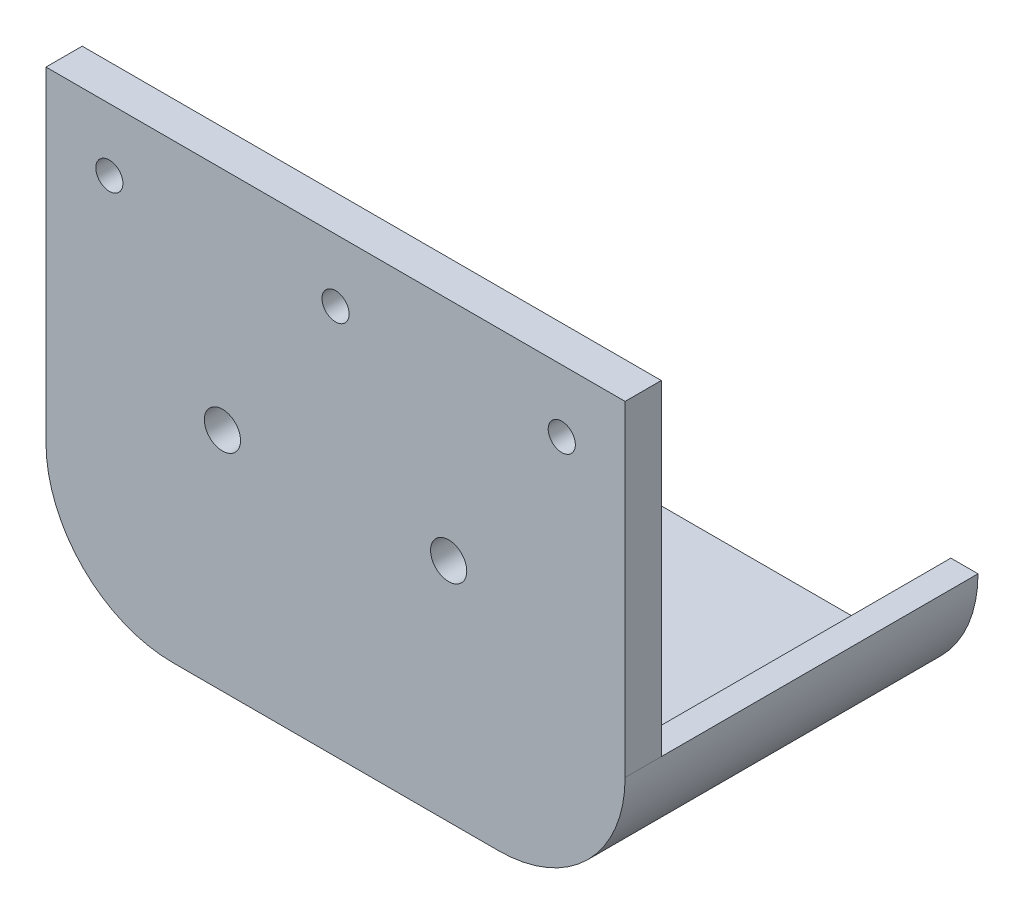
ISO-10303-21;
HEADER;
FILE_DESCRIPTION(('STEP AP214'),'2;1');
FILE_NAME('part.step','',(''),(''),'','','');
FILE_SCHEMA(('AUTOMOTIVE_DESIGN { 1 0 10303 214 1 1 1 1 }'));
ENDSEC;
DATA;
#1=APPLICATION_CONTEXT('core data for automotive mechanical design processes');
#2=APPLICATION_PROTOCOL_DEFINITION('international standard','automotive_design',2000,#1);
#3=PRODUCT_CONTEXT('',#1,'mechanical');
#4=PRODUCT('Part','Part','',(#3));
#5=PRODUCT_RELATED_PRODUCT_CATEGORY('part','',(#4));
#6=PRODUCT_DEFINITION_FORMATION('','',#4);
#7=PRODUCT_DEFINITION_CONTEXT('part definition',#1,'design');
#8=PRODUCT_DEFINITION('design','',#6,#7);
#9=PRODUCT_DEFINITION_SHAPE('','',#8);
#10=(LENGTH_UNIT() NAMED_UNIT(*) SI_UNIT(.MILLI.,.METRE.));
#11=(NAMED_UNIT(*) PLANE_ANGLE_UNIT() SI_UNIT($,.RADIAN.));
#12=(NAMED_UNIT(*) SI_UNIT($,.STERADIAN.) SOLID_ANGLE_UNIT());
#13=UNCERTAINTY_MEASURE_WITH_UNIT(LENGTH_MEASURE(1.E-05),#10,'distance_accuracy_value','');
#14=(GEOMETRIC_REPRESENTATION_CONTEXT(3) GLOBAL_UNCERTAINTY_ASSIGNED_CONTEXT((#13)) GLOBAL_UNIT_ASSIGNED_CONTEXT((#10,
#11,#12)) REPRESENTATION_CONTEXT('',''));
#15=CARTESIAN_POINT('',(0.,0.,0.));
#16=DIRECTION('',(0.,0.,1.));
#17=DIRECTION('',(1.,0.,0.));
#18=AXIS2_PLACEMENT_3D('',#15,#16,#17);
#19=CARTESIAN_POINT('',(0.,0.,0.));
#20=DIRECTION('',(0.,0.,-1.));
#21=DIRECTION('',(-1.,0.,0.));
#22=AXIS2_PLACEMENT_3D('',#19,#20,#21);
#23=PLANE('',#22);
#24=CARTESIAN_POINT('',(125.,90.5193349511584,0.));
#25=DIRECTION('',(0.,0.,1.));
#26=DIRECTION('',(1.,0.,0.));
#27=AXIS2_PLACEMENT_3D('',#24,#25,#26);
#28=CIRCLE('',#27,7.50000000000001);
#29=CARTESIAN_POINT('',(132.5,90.5193349511584,0.));
#30=VERTEX_POINT('',#29);
#31=EDGE_CURVE('E188',#30,#30,#28,.T.);
#32=ORIENTED_EDGE('',*,*,#31,.T.);
#33=EDGE_LOOP('',(#32));
#34=FACE_BOUND('',#33,.T.);
#35=CARTESIAN_POINT('',(-125.,90.5193349511584,0.));
#36=DIRECTION('',(0.,0.,1.));
#37=DIRECTION('',(1.,0.,0.));
#38=AXIS2_PLACEMENT_3D('',#35,#36,#37);
#39=CIRCLE('',#38,7.50000000000001);
#40=CARTESIAN_POINT('',(-117.5,90.5193349511584,0.));
#41=VERTEX_POINT('',#40);
#42=EDGE_CURVE('E193',#41,#41,#39,.T.);
#43=ORIENTED_EDGE('',*,*,#42,.T.);
#44=EDGE_LOOP('',(#43));
#45=FACE_BOUND('',#44,.T.);
#46=CARTESIAN_POINT('',(0.,90.5193349511584,0.));
#47=DIRECTION('',(0.,0.,1.));
#48=DIRECTION('',(1.,0.,0.));
#49=AXIS2_PLACEMENT_3D('',#46,#47,#48);
#50=CIRCLE('',#49,7.5);
#51=CARTESIAN_POINT('',(7.5,90.5193349511584,0.));
#52=VERTEX_POINT('',#51);
#53=EDGE_CURVE('E201',#52,#52,#50,.T.);
#54=ORIENTED_EDGE('',*,*,#53,.T.);
#55=EDGE_LOOP('',(#54));
#56=FACE_BOUND('',#55,.T.);
#57=CARTESIAN_POINT('',(62.5,0.,0.));
#58=DIRECTION('',(0.,0.,1.));
#59=DIRECTION('',(1.,0.,0.));
#60=AXIS2_PLACEMENT_3D('',#57,#58,#59);
#61=CIRCLE('',#60,9.99999999999999);
#62=CARTESIAN_POINT('',(72.5,0.,0.));
#63=VERTEX_POINT('',#62);
#64=EDGE_CURVE('E210',#63,#63,#61,.T.);
#65=ORIENTED_EDGE('',*,*,#64,.T.);
#66=EDGE_LOOP('',(#65));
#67=FACE_BOUND('',#66,.T.);
#68=CARTESIAN_POINT('',(-62.5,0.,0.));
#69=DIRECTION('',(0.,0.,1.));
#70=DIRECTION('',(1.,0.,0.));
#71=AXIS2_PLACEMENT_3D('',#68,#69,#70);
#72=CIRCLE('',#71,9.99999999999999);
#73=CARTESIAN_POINT('',(-52.5,0.,0.));
#74=VERTEX_POINT('',#73);
#75=EDGE_CURVE('E204',#74,#74,#72,.T.);
#76=ORIENTED_EDGE('',*,*,#75,.T.);
#77=EDGE_LOOP('',(#76));
#78=FACE_BOUND('',#77,.T.);
#79=DIRECTION('',(0.,1.,0.));
#80=VECTOR('',#79,1.);
#81=CARTESIAN_POINT('',(160.,-125.,0.));
#82=LINE('',#81,#80);
#83=CARTESIAN_POINT('',(160.,-55.,0.));
#84=VERTEX_POINT('',#83);
#85=CARTESIAN_POINT('',(160.,125.,0.));
#86=VERTEX_POINT('',#85);
#87=EDGE_CURVE('E216',#84,#86,#82,.T.);
#88=ORIENTED_EDGE('',*,*,#87,.F.);
#89=DIRECTION('',(-1.,0.,0.));
#90=VECTOR('',#89,1.);
#91=CARTESIAN_POINT('',(0.,-55.,0.));
#92=LINE('',#91,#90);
#93=CARTESIAN_POINT('',(145.,-55.,0.));
#94=VERTEX_POINT('',#93);
#95=EDGE_CURVE('E146',#84,#94,#92,.T.);
#96=ORIENTED_EDGE('',*,*,#95,.T.);
#97=CARTESIAN_POINT('',(89.9999999999993,-55.,0.));
#98=DIRECTION('',(0.,0.,-1.));
#99=DIRECTION('',(-1.,0.,0.));
#100=AXIS2_PLACEMENT_3D('',#97,#98,#99);
#101=CIRCLE('',#100,55.0000000000002);
#102=CARTESIAN_POINT('',(90.,-110.,0.));
#103=VERTEX_POINT('',#102);
#104=EDGE_CURVE('E149',#94,#103,#101,.T.);
#105=ORIENTED_EDGE('',*,*,#104,.T.);
#106=DIRECTION('',(-1.,0.,0.));
#107=VECTOR('',#106,1.);
#108=CARTESIAN_POINT('',(0.,-110.,0.));
#109=LINE('',#108,#107);
#110=CARTESIAN_POINT('',(-90.0000000000007,-110.,0.));
#111=VERTEX_POINT('',#110);
#112=EDGE_CURVE('E173',#103,#111,#109,.T.);
#113=ORIENTED_EDGE('',*,*,#112,.T.);
#114=CARTESIAN_POINT('',(-90.0000000000007,-55.,0.));
#115=DIRECTION('',(0.,0.,-1.));
#116=DIRECTION('',(-1.,0.,0.));
#117=AXIS2_PLACEMENT_3D('',#114,#115,#116);
#118=CIRCLE('',#117,54.9999999999996);
#119=CARTESIAN_POINT('',(-145.,-55.,0.));
#120=VERTEX_POINT('',#119);
#121=EDGE_CURVE('E170',#111,#120,#118,.T.);
#122=ORIENTED_EDGE('',*,*,#121,.T.);
#123=DIRECTION('',(-1.,0.,0.));
#124=VECTOR('',#123,1.);
#125=CARTESIAN_POINT('',(0.,-55.,0.));
#126=LINE('',#125,#124);
#127=CARTESIAN_POINT('',(-160.,-55.,0.));
#128=VERTEX_POINT('',#127);
#129=EDGE_CURVE('E167',#120,#128,#126,.T.);
#130=ORIENTED_EDGE('',*,*,#129,.T.);
#131=DIRECTION('',(0.,-1.,0.));
#132=VECTOR('',#131,1.);
#133=CARTESIAN_POINT('',(-160.,-125.,0.));
#134=LINE('',#133,#132);
#135=CARTESIAN_POINT('',(-160.,125.,0.));
#136=VERTEX_POINT('',#135);
#137=EDGE_CURVE('E222',#136,#128,#134,.T.);
#138=ORIENTED_EDGE('',*,*,#137,.F.);
#139=DIRECTION('',(-1.,0.,0.));
#140=VECTOR('',#139,1.);
#141=CARTESIAN_POINT('',(-160.,125.,0.));
#142=LINE('',#141,#140);
#143=EDGE_CURVE('E229',#86,#136,#142,.T.);
#144=ORIENTED_EDGE('',*,*,#143,.F.);
#145=EDGE_LOOP('',(#88,#96,#105,#113,#122,#130,#138,#144));
#146=FACE_BOUND('',#145,.T.);
#147=ADVANCED_FACE('F41',(#34,#45,#56,#67,#78,#146),#23,.T.);
#148=CARTESIAN_POINT('',(0.,0.,20.));
#149=DIRECTION('',(0.,0.,-1.));
#150=DIRECTION('',(-1.,0.,0.));
#151=AXIS2_PLACEMENT_3D('',#148,#149,#150);
#152=PLANE('',#151);
#153=CARTESIAN_POINT('',(125.,90.5193349511584,20.));
#154=DIRECTION('',(0.,0.,1.));
#155=DIRECTION('',(1.,0.,0.));
#156=AXIS2_PLACEMENT_3D('',#153,#154,#155);
#157=CIRCLE('',#156,7.50000000000001);
#158=CARTESIAN_POINT('',(132.5,90.5193349511584,20.));
#159=VERTEX_POINT('',#158);
#160=EDGE_CURVE('E196',#159,#159,#157,.T.);
#161=ORIENTED_EDGE('',*,*,#160,.F.);
#162=EDGE_LOOP('',(#161));
#163=FACE_BOUND('',#162,.T.);
#164=CARTESIAN_POINT('',(-125.,90.5193349511584,20.));
#165=DIRECTION('',(0.,0.,1.));
#166=DIRECTION('',(1.,0.,0.));
#167=AXIS2_PLACEMENT_3D('',#164,#165,#166);
#168=CIRCLE('',#167,7.50000000000001);
#169=CARTESIAN_POINT('',(-117.5,90.5193349511584,20.));
#170=VERTEX_POINT('',#169);
#171=EDGE_CURVE('E189',#170,#170,#168,.T.);
#172=ORIENTED_EDGE('',*,*,#171,.F.);
#173=EDGE_LOOP('',(#172));
#174=FACE_BOUND('',#173,.T.);
#175=CARTESIAN_POINT('',(0.,90.5193349511584,20.));
#176=DIRECTION('',(0.,0.,1.));
#177=DIRECTION('',(1.,0.,0.));
#178=AXIS2_PLACEMENT_3D('',#175,#176,#177);
#179=CIRCLE('',#178,7.5);
#180=CARTESIAN_POINT('',(7.5,90.5193349511584,20.));
#181=VERTEX_POINT('',#180);
#182=EDGE_CURVE('E192',#181,#181,#179,.T.);
#183=ORIENTED_EDGE('',*,*,#182,.F.);
#184=EDGE_LOOP('',(#183));
#185=FACE_BOUND('',#184,.T.);
#186=DIRECTION('',(1.,0.,0.));
#187=VECTOR('',#186,1.);
#188=CARTESIAN_POINT('',(-160.,-125.,20.));
#189=LINE('',#188,#187);
#190=CARTESIAN_POINT('',(-90.,-125.,20.));
#191=VERTEX_POINT('',#190);
#192=CARTESIAN_POINT('',(90.,-125.,20.));
#193=VERTEX_POINT('',#192);
#194=EDGE_CURVE('E128',#191,#193,#189,.T.);
#195=ORIENTED_EDGE('',*,*,#194,.T.);
#196=CARTESIAN_POINT('',(90.,-55.,20.));
#197=DIRECTION('',(0.,0.,-1.));
#198=DIRECTION('',(-1.,0.,0.));
#199=AXIS2_PLACEMENT_3D('',#196,#197,#198);
#200=CIRCLE('',#199,70.);
#201=CARTESIAN_POINT('',(160.,-55.,20.));
#202=VERTEX_POINT('',#201);
#203=EDGE_CURVE('E49',#193,#202,#200,.F.);
#204=ORIENTED_EDGE('',*,*,#203,.T.);
#205=DIRECTION('',(0.,1.,0.));
#206=VECTOR('',#205,1.);
#207=CARTESIAN_POINT('',(160.,-125.,20.));
#208=LINE('',#207,#206);
#209=CARTESIAN_POINT('',(160.,125.,20.));
#210=VERTEX_POINT('',#209);
#211=EDGE_CURVE('E219',#202,#210,#208,.T.);
#212=ORIENTED_EDGE('',*,*,#211,.T.);
#213=DIRECTION('',(-1.,0.,0.));
#214=VECTOR('',#213,1.);
#215=CARTESIAN_POINT('',(-160.,125.,20.));
#216=LINE('',#215,#214);
#217=CARTESIAN_POINT('',(-160.,125.,20.));
#218=VERTEX_POINT('',#217);
#219=EDGE_CURVE('E221',#210,#218,#216,.T.);
#220=ORIENTED_EDGE('',*,*,#219,.T.);
#221=DIRECTION('',(0.,-1.,0.));
#222=VECTOR('',#221,1.);
#223=CARTESIAN_POINT('',(-160.,-125.,20.));
#224=LINE('',#223,#222);
#225=CARTESIAN_POINT('',(-160.,-55.,20.));
#226=VERTEX_POINT('',#225);
#227=EDGE_CURVE('E224',#218,#226,#224,.T.);
#228=ORIENTED_EDGE('',*,*,#227,.T.);
#229=CARTESIAN_POINT('',(-90.,-55.,20.));
#230=DIRECTION('',(0.,0.,-1.));
#231=DIRECTION('',(-1.,0.,0.));
#232=AXIS2_PLACEMENT_3D('',#229,#230,#231);
#233=CIRCLE('',#232,70.);
#234=EDGE_CURVE('E240',#226,#191,#233,.F.);
#235=ORIENTED_EDGE('',*,*,#234,.T.);
#236=EDGE_LOOP('',(#195,#204,#212,#220,#228,#235));
#237=FACE_BOUND('',#236,.T.);
#238=CARTESIAN_POINT('',(62.5,0.,20.));
#239=DIRECTION('',(0.,0.,1.));
#240=DIRECTION('',(1.,0.,0.));
#241=AXIS2_PLACEMENT_3D('',#238,#239,#240);
#242=CIRCLE('',#241,9.99999999999999);
#243=CARTESIAN_POINT('',(72.5,0.,20.));
#244=VERTEX_POINT('',#243);
#245=EDGE_CURVE('E213',#244,#244,#242,.T.);
#246=ORIENTED_EDGE('',*,*,#245,.F.);
#247=EDGE_LOOP('',(#246));
#248=FACE_BOUND('',#247,.T.);
#249=CARTESIAN_POINT('',(-62.5,0.,20.));
#250=DIRECTION('',(0.,0.,1.));
#251=DIRECTION('',(1.,0.,0.));
#252=AXIS2_PLACEMENT_3D('',#249,#250,#251);
#253=CIRCLE('',#252,9.99999999999999);
#254=CARTESIAN_POINT('',(-52.5,0.,20.));
#255=VERTEX_POINT('',#254);
#256=EDGE_CURVE('E207',#255,#255,#253,.T.);
#257=ORIENTED_EDGE('',*,*,#256,.F.);
#258=EDGE_LOOP('',(#257));
#259=FACE_BOUND('',#258,.T.);
#260=ADVANCED_FACE('F244',(#163,#174,#185,#237,#248,#259),#152,.F.);
#261=CARTESIAN_POINT('',(160.,-125.,20.));
#262=DIRECTION('',(-1.,0.,0.));
#263=DIRECTION('',(0.,0.,1.));
#264=AXIS2_PLACEMENT_3D('',#261,#262,#263);
#265=PLANE('',#264);
#266=ORIENTED_EDGE('',*,*,#211,.F.);
#267=DIRECTION('',(0.,0.,-1.));
#268=VECTOR('',#267,1.);
#269=CARTESIAN_POINT('',(160.,-55.,20.));
#270=LINE('',#269,#268);
#271=EDGE_CURVE('E131',#202,#84,#270,.T.);
#272=ORIENTED_EDGE('',*,*,#271,.T.);
#273=ORIENTED_EDGE('',*,*,#87,.T.);
#274=DIRECTION('',(0.,0.,-1.));
#275=VECTOR('',#274,1.);
#276=CARTESIAN_POINT('',(160.,125.,20.));
#277=LINE('',#276,#275);
#278=EDGE_CURVE('E234',#210,#86,#277,.T.);
#279=ORIENTED_EDGE('',*,*,#278,.F.);
#280=EDGE_LOOP('',(#266,#272,#273,#279));
#281=FACE_BOUND('',#280,.T.);
#282=ADVANCED_FACE('F251',(#281),#265,.F.);
#283=CARTESIAN_POINT('',(-160.,125.,20.));
#284=DIRECTION('',(0.,-1.,0.));
#285=DIRECTION('',(0.,0.,-1.));
#286=AXIS2_PLACEMENT_3D('',#283,#284,#285);
#287=PLANE('',#286);
#288=ORIENTED_EDGE('',*,*,#143,.T.);
#289=DIRECTION('',(0.,0.,-1.));
#290=VECTOR('',#289,1.);
#291=CARTESIAN_POINT('',(-160.,125.,20.));
#292=LINE('',#291,#290);
#293=EDGE_CURVE('E227',#218,#136,#292,.T.);
#294=ORIENTED_EDGE('',*,*,#293,.F.);
#295=ORIENTED_EDGE('',*,*,#219,.F.);
#296=ORIENTED_EDGE('',*,*,#278,.T.);
#297=EDGE_LOOP('',(#288,#294,#295,#296));
#298=FACE_BOUND('',#297,.T.);
#299=ADVANCED_FACE('F263',(#298),#287,.F.);
#300=CARTESIAN_POINT('',(-160.,-125.,20.));
#301=DIRECTION('',(1.,0.,0.));
#302=DIRECTION('',(0.,0.,-1.));
#303=AXIS2_PLACEMENT_3D('',#300,#301,#302);
#304=PLANE('',#303);
#305=ORIENTED_EDGE('',*,*,#137,.T.);
#306=DIRECTION('',(0.,0.,-1.));
#307=VECTOR('',#306,1.);
#308=CARTESIAN_POINT('',(-160.,-55.,20.));
#309=LINE('',#308,#307);
#310=EDGE_CURVE('E11',#128,#226,#309,.F.);
#311=ORIENTED_EDGE('',*,*,#310,.T.);
#312=ORIENTED_EDGE('',*,*,#227,.F.);
#313=ORIENTED_EDGE('',*,*,#293,.T.);
#314=EDGE_LOOP('',(#305,#311,#312,#313));
#315=FACE_BOUND('',#314,.T.);
#316=ADVANCED_FACE('F264',(#315),#304,.F.);
#317=CARTESIAN_POINT('',(-160.,-125.,20.));
#318=DIRECTION('',(0.,1.,0.));
#319=DIRECTION('',(0.,0.,1.));
#320=AXIS2_PLACEMENT_3D('',#317,#318,#319);
#321=PLANE('',#320);
#322=DIRECTION('',(0.,0.,-1.));
#323=VECTOR('',#322,1.);
#324=CARTESIAN_POINT('',(-90.,-125.,20.));
#325=LINE('',#324,#323);
#326=CARTESIAN_POINT('',(-90.,-125.,-175.));
#327=VERTEX_POINT('',#326);
#328=EDGE_CURVE('E123',#191,#327,#325,.T.);
#329=ORIENTED_EDGE('',*,*,#328,.T.);
#330=DIRECTION('',(-1.,0.,0.));
#331=VECTOR('',#330,1.);
#332=CARTESIAN_POINT('',(0.,-125.,-175.));
#333=LINE('',#332,#331);
#334=CARTESIAN_POINT('',(90.,-125.,-175.));
#335=VERTEX_POINT('',#334);
#336=EDGE_CURVE('E127',#335,#327,#333,.T.);
#337=ORIENTED_EDGE('',*,*,#336,.F.);
#338=DIRECTION('',(0.,0.,-1.));
#339=VECTOR('',#338,1.);
#340=CARTESIAN_POINT('',(90.,-125.,20.));
#341=LINE('',#340,#339);
#342=EDGE_CURVE('E62',#335,#193,#341,.F.);
#343=ORIENTED_EDGE('',*,*,#342,.T.);
#344=ORIENTED_EDGE('',*,*,#194,.F.);
#345=EDGE_LOOP('',(#329,#337,#343,#344));
#346=FACE_BOUND('',#345,.T.);
#347=ADVANCED_FACE('F125',(#346),#321,.F.);
#348=CARTESIAN_POINT('',(62.5,0.,20.));
#349=DIRECTION('',(0.,0.,-1.));
#350=DIRECTION('',(-1.,0.,0.));
#351=AXIS2_PLACEMENT_3D('',#348,#349,#350);
#352=CYLINDRICAL_SURFACE('',#351,9.99999999999999);
#353=ORIENTED_EDGE('',*,*,#245,.T.);
#354=EDGE_LOOP('',(#353));
#355=FACE_BOUND('',#354,.T.);
#356=ORIENTED_EDGE('',*,*,#64,.F.);
#357=EDGE_LOOP('',(#356));
#358=FACE_BOUND('',#357,.T.);
#359=ADVANCED_FACE('F271',(#355,#358),#352,.F.);
#360=CARTESIAN_POINT('',(-62.5,0.,20.));
#361=DIRECTION('',(0.,0.,-1.));
#362=DIRECTION('',(-1.,0.,0.));
#363=AXIS2_PLACEMENT_3D('',#360,#361,#362);
#364=CYLINDRICAL_SURFACE('',#363,9.99999999999999);
#365=ORIENTED_EDGE('',*,*,#256,.T.);
#366=EDGE_LOOP('',(#365));
#367=FACE_BOUND('',#366,.T.);
#368=ORIENTED_EDGE('',*,*,#75,.F.);
#369=EDGE_LOOP('',(#368));
#370=FACE_BOUND('',#369,.T.);
#371=ADVANCED_FACE('F287',(#367,#370),#364,.F.);
#372=CARTESIAN_POINT('',(0.,90.5193349511584,0.));
#373=DIRECTION('',(0.,0.,1.));
#374=DIRECTION('',(1.,0.,0.));
#375=AXIS2_PLACEMENT_3D('',#372,#373,#374);
#376=CYLINDRICAL_SURFACE('',#375,7.5);
#377=ORIENTED_EDGE('',*,*,#53,.F.);
#378=EDGE_LOOP('',(#377));
#379=FACE_BOUND('',#378,.T.);
#380=ORIENTED_EDGE('',*,*,#182,.T.);
#381=EDGE_LOOP('',(#380));
#382=FACE_BOUND('',#381,.T.);
#383=ADVANCED_FACE('F291',(#379,#382),#376,.F.);
#384=CARTESIAN_POINT('',(-125.,90.5193349511584,0.));
#385=DIRECTION('',(0.,0.,1.));
#386=DIRECTION('',(1.,0.,0.));
#387=AXIS2_PLACEMENT_3D('',#384,#385,#386);
#388=CYLINDRICAL_SURFACE('',#387,7.50000000000001);
#389=ORIENTED_EDGE('',*,*,#42,.F.);
#390=EDGE_LOOP('',(#389));
#391=FACE_BOUND('',#390,.T.);
#392=ORIENTED_EDGE('',*,*,#171,.T.);
#393=EDGE_LOOP('',(#392));
#394=FACE_BOUND('',#393,.T.);
#395=ADVANCED_FACE('F295',(#391,#394),#388,.F.);
#396=CARTESIAN_POINT('',(125.,90.5193349511584,0.));
#397=DIRECTION('',(0.,0.,1.));
#398=DIRECTION('',(1.,0.,0.));
#399=AXIS2_PLACEMENT_3D('',#396,#397,#398);
#400=CYLINDRICAL_SURFACE('',#399,7.50000000000001);
#401=ORIENTED_EDGE('',*,*,#31,.F.);
#402=EDGE_LOOP('',(#401));
#403=FACE_BOUND('',#402,.T.);
#404=ORIENTED_EDGE('',*,*,#160,.T.);
#405=EDGE_LOOP('',(#404));
#406=FACE_BOUND('',#405,.T.);
#407=ADVANCED_FACE('F297',(#403,#406),#400,.F.);
#408=CARTESIAN_POINT('',(90.,-55.,20.));
#409=DIRECTION('',(0.,0.,-1.));
#410=DIRECTION('',(-1.,0.,0.));
#411=AXIS2_PLACEMENT_3D('',#408,#409,#410);
#412=CYLINDRICAL_SURFACE('',#411,70.);
#413=ORIENTED_EDGE('',*,*,#203,.F.);
#414=ORIENTED_EDGE('',*,*,#342,.F.);
#415=CARTESIAN_POINT('',(90.,-55.,-175.));
#416=DIRECTION('',(0.,0.,-1.));
#417=DIRECTION('',(-1.,0.,0.));
#418=AXIS2_PLACEMENT_3D('',#415,#416,#417);
#419=CIRCLE('',#418,70.);
#420=CARTESIAN_POINT('',(160.,-55.,-175.));
#421=VERTEX_POINT('',#420);
#422=EDGE_CURVE('E145',#421,#335,#419,.T.);
#423=ORIENTED_EDGE('',*,*,#422,.F.);
#424=DIRECTION('',(0.,0.,1.));
#425=VECTOR('',#424,1.);
#426=CARTESIAN_POINT('',(160.,-55.,-175.));
#427=LINE('',#426,#425);
#428=EDGE_CURVE('E166',#421,#84,#427,.T.);
#429=ORIENTED_EDGE('',*,*,#428,.T.);
#430=ORIENTED_EDGE('',*,*,#271,.F.);
#431=EDGE_LOOP('',(#413,#414,#423,#429,#430));
#432=FACE_BOUND('',#431,.T.);
#433=ADVANCED_FACE('F253',(#432),#412,.T.);
#434=CARTESIAN_POINT('',(-90.,-55.,20.));
#435=DIRECTION('',(0.,0.,-1.));
#436=DIRECTION('',(-1.,0.,0.));
#437=AXIS2_PLACEMENT_3D('',#434,#435,#436);
#438=CYLINDRICAL_SURFACE('',#437,70.);
#439=ORIENTED_EDGE('',*,*,#234,.F.);
#440=ORIENTED_EDGE('',*,*,#310,.F.);
#441=DIRECTION('',(0.,0.,1.));
#442=VECTOR('',#441,1.);
#443=CARTESIAN_POINT('',(-160.,-55.,-175.));
#444=LINE('',#443,#442);
#445=CARTESIAN_POINT('',(-160.,-55.,-175.));
#446=VERTEX_POINT('',#445);
#447=EDGE_CURVE('E135',#446,#128,#444,.T.);
#448=ORIENTED_EDGE('',*,*,#447,.F.);
#449=CARTESIAN_POINT('',(-90.,-55.,-175.));
#450=DIRECTION('',(0.,0.,-1.));
#451=DIRECTION('',(-1.,0.,0.));
#452=AXIS2_PLACEMENT_3D('',#449,#450,#451);
#453=CIRCLE('',#452,70.);
#454=EDGE_CURVE('E134',#327,#446,#453,.T.);
#455=ORIENTED_EDGE('',*,*,#454,.F.);
#456=ORIENTED_EDGE('',*,*,#328,.F.);
#457=EDGE_LOOP('',(#439,#440,#448,#455,#456));
#458=FACE_BOUND('',#457,.T.);
#459=ADVANCED_FACE('F43',(#458),#438,.T.);
#460=CARTESIAN_POINT('',(0.,-55.,-175.));
#461=DIRECTION('',(0.,1.,0.));
#462=DIRECTION('',(0.,0.,1.));
#463=AXIS2_PLACEMENT_3D('',#460,#461,#462);
#464=PLANE('',#463);
#465=ORIENTED_EDGE('',*,*,#129,.F.);
#466=DIRECTION('',(0.,0.,1.));
#467=VECTOR('',#466,1.);
#468=CARTESIAN_POINT('',(-145.,-55.,-175.));
#469=LINE('',#468,#467);
#470=CARTESIAN_POINT('',(-145.,-55.,-175.));
#471=VERTEX_POINT('',#470);
#472=EDGE_CURVE('E185',#471,#120,#469,.T.);
#473=ORIENTED_EDGE('',*,*,#472,.F.);
#474=DIRECTION('',(-1.,0.,0.));
#475=VECTOR('',#474,1.);
#476=CARTESIAN_POINT('',(0.,-55.,-175.));
#477=LINE('',#476,#475);
#478=EDGE_CURVE('E139',#471,#446,#477,.T.);
#479=ORIENTED_EDGE('',*,*,#478,.T.);
#480=ORIENTED_EDGE('',*,*,#447,.T.);
#481=EDGE_LOOP('',(#465,#473,#479,#480));
#482=FACE_BOUND('',#481,.T.);
#483=ADVANCED_FACE('F304',(#482),#464,.T.);
#484=CARTESIAN_POINT('',(-90.0000000000007,-55.,-175.));
#485=DIRECTION('',(0.,0.,1.));
#486=DIRECTION('',(1.,0.,0.));
#487=AXIS2_PLACEMENT_3D('',#484,#485,#486);
#488=CYLINDRICAL_SURFACE('',#487,54.9999999999996);
#489=ORIENTED_EDGE('',*,*,#121,.F.);
#490=DIRECTION('',(0.,0.,1.));
#491=VECTOR('',#490,1.);
#492=CARTESIAN_POINT('',(-90.0000000000007,-110.,-175.));
#493=LINE('',#492,#491);
#494=CARTESIAN_POINT('',(-90.0000000000007,-110.,-175.));
#495=VERTEX_POINT('',#494);
#496=EDGE_CURVE('E183',#495,#111,#493,.T.);
#497=ORIENTED_EDGE('',*,*,#496,.F.);
#498=CARTESIAN_POINT('',(-90.0000000000007,-55.,-175.));
#499=DIRECTION('',(0.,0.,-1.));
#500=DIRECTION('',(-1.,0.,0.));
#501=AXIS2_PLACEMENT_3D('',#498,#499,#500);
#502=CIRCLE('',#501,54.9999999999996);
#503=EDGE_CURVE('E153',#495,#471,#502,.T.);
#504=ORIENTED_EDGE('',*,*,#503,.T.);
#505=ORIENTED_EDGE('',*,*,#472,.T.);
#506=EDGE_LOOP('',(#489,#497,#504,#505));
#507=FACE_BOUND('',#506,.T.);
#508=ADVANCED_FACE('F307',(#507),#488,.F.);
#509=CARTESIAN_POINT('',(0.,-110.,-175.));
#510=DIRECTION('',(0.,1.,0.));
#511=DIRECTION('',(0.,0.,1.));
#512=AXIS2_PLACEMENT_3D('',#509,#510,#511);
#513=PLANE('',#512);
#514=ORIENTED_EDGE('',*,*,#112,.F.);
#515=DIRECTION('',(0.,0.,1.));
#516=VECTOR('',#515,1.);
#517=CARTESIAN_POINT('',(90.,-110.,-175.));
#518=LINE('',#517,#516);
#519=CARTESIAN_POINT('',(90.,-110.,-175.));
#520=VERTEX_POINT('',#519);
#521=EDGE_CURVE('E181',#520,#103,#518,.T.);
#522=ORIENTED_EDGE('',*,*,#521,.F.);
#523=DIRECTION('',(-1.,0.,0.));
#524=VECTOR('',#523,1.);
#525=CARTESIAN_POINT('',(0.,-110.,-175.));
#526=LINE('',#525,#524);
#527=EDGE_CURVE('E156',#520,#495,#526,.T.);
#528=ORIENTED_EDGE('',*,*,#527,.T.);
#529=ORIENTED_EDGE('',*,*,#496,.T.);
#530=EDGE_LOOP('',(#514,#522,#528,#529));
#531=FACE_BOUND('',#530,.T.);
#532=ADVANCED_FACE('F311',(#531),#513,.T.);
#533=CARTESIAN_POINT('',(89.9999999999993,-55.,-175.));
#534=DIRECTION('',(0.,0.,1.));
#535=DIRECTION('',(1.,0.,0.));
#536=AXIS2_PLACEMENT_3D('',#533,#534,#535);
#537=CYLINDRICAL_SURFACE('',#536,55.0000000000002);
#538=ORIENTED_EDGE('',*,*,#104,.F.);
#539=DIRECTION('',(0.,0.,1.));
#540=VECTOR('',#539,1.);
#541=CARTESIAN_POINT('',(145.,-55.,-175.));
#542=LINE('',#541,#540);
#543=CARTESIAN_POINT('',(145.,-55.,-175.));
#544=VERTEX_POINT('',#543);
#545=EDGE_CURVE('E179',#544,#94,#542,.T.);
#546=ORIENTED_EDGE('',*,*,#545,.F.);
#547=CARTESIAN_POINT('',(89.9999999999993,-55.,-175.));
#548=DIRECTION('',(0.,0.,-1.));
#549=DIRECTION('',(-1.,0.,0.));
#550=AXIS2_PLACEMENT_3D('',#547,#548,#549);
#551=CIRCLE('',#550,55.0000000000002);
#552=EDGE_CURVE('E159',#544,#520,#551,.T.);
#553=ORIENTED_EDGE('',*,*,#552,.T.);
#554=ORIENTED_EDGE('',*,*,#521,.T.);
#555=EDGE_LOOP('',(#538,#546,#553,#554));
#556=FACE_BOUND('',#555,.T.);
#557=ADVANCED_FACE('F315',(#556),#537,.F.);
#558=CARTESIAN_POINT('',(0.,-55.,-175.));
#559=DIRECTION('',(0.,1.,0.));
#560=DIRECTION('',(0.,0.,1.));
#561=AXIS2_PLACEMENT_3D('',#558,#559,#560);
#562=PLANE('',#561);
#563=ORIENTED_EDGE('',*,*,#95,.F.);
#564=ORIENTED_EDGE('',*,*,#428,.F.);
#565=DIRECTION('',(-1.,0.,0.));
#566=VECTOR('',#565,1.);
#567=CARTESIAN_POINT('',(0.,-55.,-175.));
#568=LINE('',#567,#566);
#569=EDGE_CURVE('E162',#421,#544,#568,.T.);
#570=ORIENTED_EDGE('',*,*,#569,.T.);
#571=ORIENTED_EDGE('',*,*,#545,.T.);
#572=EDGE_LOOP('',(#563,#564,#570,#571));
#573=FACE_BOUND('',#572,.T.);
#574=ADVANCED_FACE('F256',(#573),#562,.T.);
#575=CARTESIAN_POINT('',(0.,0.,-175.));
#576=DIRECTION('',(0.,0.,-1.));
#577=DIRECTION('',(-1.,0.,0.));
#578=AXIS2_PLACEMENT_3D('',#575,#576,#577);
#579=PLANE('',#578);
#580=ORIENTED_EDGE('',*,*,#336,.T.);
#581=ORIENTED_EDGE('',*,*,#454,.T.);
#582=ORIENTED_EDGE('',*,*,#478,.F.);
#583=ORIENTED_EDGE('',*,*,#503,.F.);
#584=ORIENTED_EDGE('',*,*,#527,.F.);
#585=ORIENTED_EDGE('',*,*,#552,.F.);
#586=ORIENTED_EDGE('',*,*,#569,.F.);
#587=ORIENTED_EDGE('',*,*,#422,.T.);
#588=EDGE_LOOP('',(#580,#581,#582,#583,#584,#585,#586,#587));
#589=FACE_BOUND('',#588,.T.);
#590=ADVANCED_FACE('F142',(#589),#579,.T.);
#591=CLOSED_SHELL('',(#147,#260,#282,#299,#316,#347,#359,#371,#383,#395,#407,#433,#459,#483,
#508,#532,#557,#574,#590));
#592=MANIFOLD_SOLID_BREP('B2',#591);
#593=ADVANCED_BREP_SHAPE_REPRESENTATION('',(#18,#592),#14);
#594=SHAPE_DEFINITION_REPRESENTATION(#9,#593);
ENDSEC;
END-ISO-10303-21;
